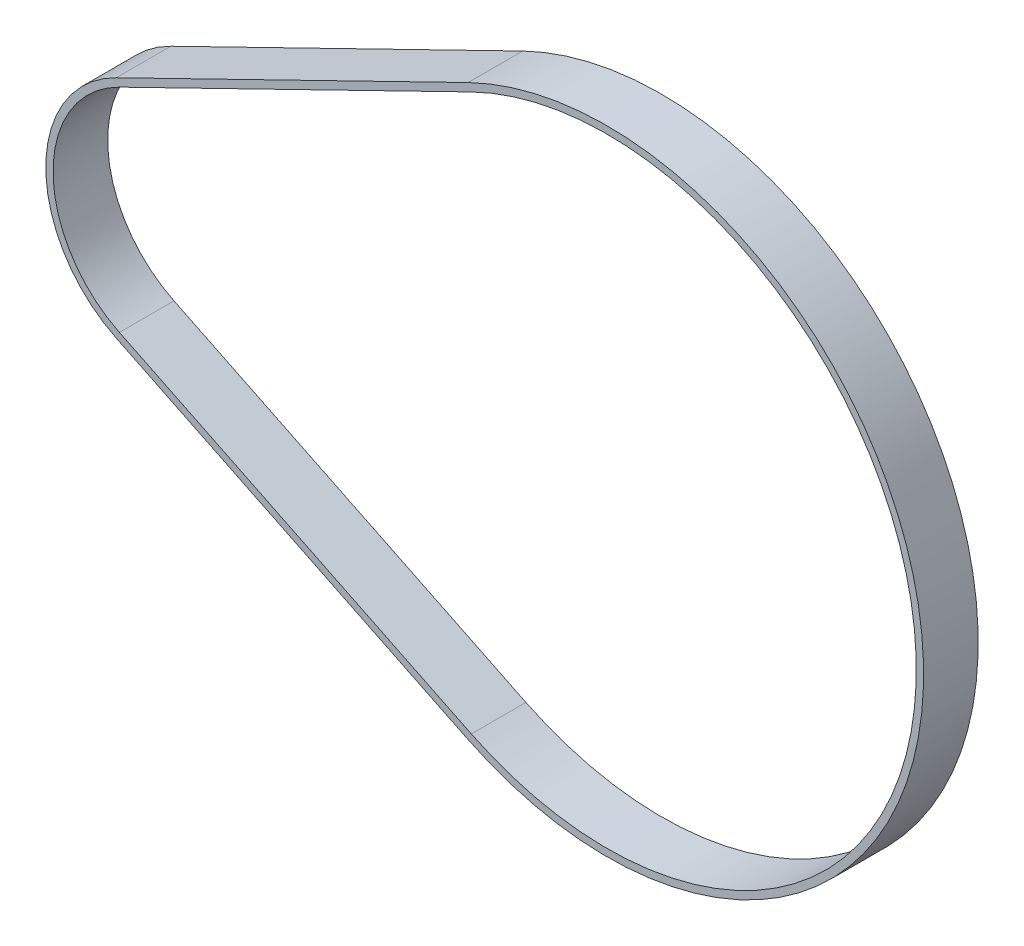
ISO-10303-21;
HEADER;
FILE_DESCRIPTION(('STEP AP214'),'2;1');
FILE_NAME('part.step','',(''),(''),'','','');
FILE_SCHEMA(('AUTOMOTIVE_DESIGN { 1 0 10303 214 1 1 1 1 }'));
ENDSEC;
DATA;
#1=APPLICATION_CONTEXT('core data for automotive mechanical design processes');
#2=APPLICATION_PROTOCOL_DEFINITION('international standard','automotive_design',2000,#1);
#3=PRODUCT_CONTEXT('',#1,'mechanical');
#4=PRODUCT('Part','Part','',(#3));
#5=PRODUCT_RELATED_PRODUCT_CATEGORY('part','',(#4));
#6=PRODUCT_DEFINITION_FORMATION('','',#4);
#7=PRODUCT_DEFINITION_CONTEXT('part definition',#1,'design');
#8=PRODUCT_DEFINITION('design','',#6,#7);
#9=PRODUCT_DEFINITION_SHAPE('','',#8);
#10=(LENGTH_UNIT() NAMED_UNIT(*) SI_UNIT(.MILLI.,.METRE.));
#11=(NAMED_UNIT(*) PLANE_ANGLE_UNIT() SI_UNIT($,.RADIAN.));
#12=(NAMED_UNIT(*) SI_UNIT($,.STERADIAN.) SOLID_ANGLE_UNIT());
#13=UNCERTAINTY_MEASURE_WITH_UNIT(LENGTH_MEASURE(1.E-05),#10,'distance_accuracy_value','');
#14=(GEOMETRIC_REPRESENTATION_CONTEXT(3) GLOBAL_UNCERTAINTY_ASSIGNED_CONTEXT((#13)) GLOBAL_UNIT_ASSIGNED_CONTEXT((#10,
#11,#12)) REPRESENTATION_CONTEXT('',''));
#15=CARTESIAN_POINT('',(0.,0.,0.));
#16=DIRECTION('',(0.,0.,1.));
#17=DIRECTION('',(1.,0.,0.));
#18=AXIS2_PLACEMENT_3D('',#15,#16,#17);
#19=CARTESIAN_POINT('',(-7.12971348626468E-13,0.,3.));
#20=DIRECTION('',(0.,0.,1.));
#21=DIRECTION('',(1.,0.,0.));
#22=AXIS2_PLACEMENT_3D('',#19,#20,#21);
#23=PLANE('',#22);
#24=CARTESIAN_POINT('',(-7.12971348626468E-13,0.,3.));
#25=DIRECTION('',(0.,0.,1.));
#26=DIRECTION('',(1.,0.,0.));
#27=AXIS2_PLACEMENT_3D('',#24,#25,#26);
#28=CIRCLE('',#27,13.7880149999993);
#29=CARTESIAN_POINT('',(-6.0485457965502,12.390498431752,3.));
#30=VERTEX_POINT('',#29);
#31=CARTESIAN_POINT('',(-6.0485457965502,-12.390498431752,3.));
#32=VERTEX_POINT('',#31);
#33=EDGE_CURVE('E115',#30,#32,#28,.T.);
#34=ORIENTED_EDGE('',*,*,#33,.T.);
#35=DIRECTION('',(0.89864265681118,-0.438681405303831,0.));
#36=VECTOR('',#35,1.);
#37=CARTESIAN_POINT('',(-6.0485457965502,-12.390498431752,3.));
#38=LINE('',#37,#36);
#39=CARTESIAN_POINT('',(32.625436737491,-31.269590001844,3.));
#40=VERTEX_POINT('',#39);
#41=EDGE_CURVE('E158',#32,#40,#38,.T.);
#42=ORIENTED_EDGE('',*,*,#41,.T.);
#43=CARTESIAN_POINT('',(47.8899999999999,0.,3.));
#44=DIRECTION('',(0.,0.,1.));
#45=DIRECTION('',(1.,0.,0.));
#46=AXIS2_PLACEMENT_3D('',#43,#44,#45);
#47=CIRCLE('',#46,34.7964675);
#48=CARTESIAN_POINT('',(32.625436737491,31.269590001844,3.));
#49=VERTEX_POINT('',#48);
#50=EDGE_CURVE('E160',#40,#49,#47,.T.);
#51=ORIENTED_EDGE('',*,*,#50,.T.);
#52=DIRECTION('',(-0.89864265681118,-0.438681405303831,0.));
#53=VECTOR('',#52,1.);
#54=CARTESIAN_POINT('',(32.625436737491,31.269590001844,3.));
#55=LINE('',#54,#53);
#56=EDGE_CURVE('E62',#49,#30,#55,.T.);
#57=ORIENTED_EDGE('',*,*,#56,.T.);
#58=EDGE_LOOP('',(#34,#42,#51,#57));
#59=FACE_BOUND('',#58,.T.);
#60=DIRECTION('',(0.898642656811188,-0.438681405303813,0.));
#61=VECTOR('',#60,1.);
#62=CARTESIAN_POINT('',(-5.6976006723071,-11.671584306304,3.));
#63=LINE('',#62,#61);
#64=CARTESIAN_POINT('',(-5.6976006723071,-11.671584306304,3.));
#65=VERTEX_POINT('',#64);
#66=CARTESIAN_POINT('',(32.976381861734,-30.550675876395,3.));
#67=VERTEX_POINT('',#66);
#68=EDGE_CURVE('E147',#65,#67,#63,.T.);
#69=ORIENTED_EDGE('',*,*,#68,.F.);
#70=CARTESIAN_POINT('',(-7.12971348626468E-13,0.,3.));
#71=DIRECTION('',(0.,0.,1.));
#72=DIRECTION('',(1.,0.,0.));
#73=AXIS2_PLACEMENT_3D('',#70,#71,#72);
#74=CIRCLE('',#73,12.9880150000001);
#75=CARTESIAN_POINT('',(-5.6976006723071,11.671584306304,3.));
#76=VERTEX_POINT('',#75);
#77=EDGE_CURVE('E112',#76,#65,#74,.T.);
#78=ORIENTED_EDGE('',*,*,#77,.F.);
#79=DIRECTION('',(-0.898642656811188,-0.438681405303813,0.));
#80=VECTOR('',#79,1.);
#81=CARTESIAN_POINT('',(32.976381861734,30.550675876395,3.));
#82=LINE('',#81,#80);
#83=CARTESIAN_POINT('',(32.976381861734,30.550675876395,3.));
#84=VERTEX_POINT('',#83);
#85=EDGE_CURVE('E151',#84,#76,#82,.T.);
#86=ORIENTED_EDGE('',*,*,#85,.F.);
#87=CARTESIAN_POINT('',(47.8899999999999,0.,3.));
#88=DIRECTION('',(0.,0.,1.));
#89=DIRECTION('',(1.,0.,0.));
#90=AXIS2_PLACEMENT_3D('',#87,#88,#89);
#91=CIRCLE('',#90,33.9964675);
#92=EDGE_CURVE('E149',#67,#84,#91,.T.);
#93=ORIENTED_EDGE('',*,*,#92,.F.);
#94=EDGE_LOOP('',(#69,#78,#86,#93));
#95=FACE_BOUND('',#94,.T.);
#96=ADVANCED_FACE('F39',(#59,#95),#23,.T.);
#97=CARTESIAN_POINT('',(-7.12971348626468E-13,0.,3.));
#98=DIRECTION('',(0.,0.,-1.));
#99=DIRECTION('',(-1.,0.,0.));
#100=AXIS2_PLACEMENT_3D('',#97,#98,#99);
#101=CYLINDRICAL_SURFACE('',#100,13.7880149999993);
#102=DIRECTION('',(0.,0.,-1.));
#103=VECTOR('',#102,1.);
#104=CARTESIAN_POINT('',(-6.0485457965502,12.390498431752,3.));
#105=LINE('',#104,#103);
#106=CARTESIAN_POINT('',(-6.0485457965502,12.390498431752,-3.));
#107=VERTEX_POINT('',#106);
#108=EDGE_CURVE('E163',#30,#107,#105,.T.);
#109=ORIENTED_EDGE('',*,*,#108,.T.);
#110=CARTESIAN_POINT('',(-7.12971348626468E-13,0.,-3.));
#111=DIRECTION('',(0.,0.,1.));
#112=DIRECTION('',(1.,0.,0.));
#113=AXIS2_PLACEMENT_3D('',#110,#111,#112);
#114=CIRCLE('',#113,13.7880149999993);
#115=CARTESIAN_POINT('',(-6.0485457965502,-12.390498431752,-3.));
#116=VERTEX_POINT('',#115);
#117=EDGE_CURVE('E134',#107,#116,#114,.T.);
#118=ORIENTED_EDGE('',*,*,#117,.T.);
#119=DIRECTION('',(0.,0.,-1.));
#120=VECTOR('',#119,1.);
#121=CARTESIAN_POINT('',(-6.0485457965502,-12.390498431752,3.));
#122=LINE('',#121,#120);
#123=EDGE_CURVE('E11',#32,#116,#122,.T.);
#124=ORIENTED_EDGE('',*,*,#123,.F.);
#125=ORIENTED_EDGE('',*,*,#33,.F.);
#126=EDGE_LOOP('',(#109,#118,#124,#125));
#127=FACE_BOUND('',#126,.T.);
#128=ADVANCED_FACE('F41',(#127),#101,.T.);
#129=CARTESIAN_POINT('',(-6.0485457965502,-12.390498431752,3.));
#130=DIRECTION('',(0.438681405303831,0.89864265681118,0.));
#131=DIRECTION('',(-0.89864265681118,0.438681405303831,0.));
#132=AXIS2_PLACEMENT_3D('',#129,#130,#131);
#133=PLANE('',#132);
#134=ORIENTED_EDGE('',*,*,#123,.T.);
#135=DIRECTION('',(0.89864265681118,-0.438681405303831,0.));
#136=VECTOR('',#135,1.);
#137=CARTESIAN_POINT('',(-6.0485457965502,-12.390498431752,-3.));
#138=LINE('',#137,#136);
#139=CARTESIAN_POINT('',(32.625436737491,-31.269590001844,-3.));
#140=VERTEX_POINT('',#139);
#141=EDGE_CURVE('E137',#116,#140,#138,.T.);
#142=ORIENTED_EDGE('',*,*,#141,.T.);
#143=DIRECTION('',(0.,0.,-1.));
#144=VECTOR('',#143,1.);
#145=CARTESIAN_POINT('',(32.625436737491,-31.269590001844,3.));
#146=LINE('',#145,#144);
#147=EDGE_CURVE('E47',#40,#140,#146,.T.);
#148=ORIENTED_EDGE('',*,*,#147,.F.);
#149=ORIENTED_EDGE('',*,*,#41,.F.);
#150=EDGE_LOOP('',(#134,#142,#148,#149));
#151=FACE_BOUND('',#150,.T.);
#152=ADVANCED_FACE('F176',(#151),#133,.F.);
#153=CARTESIAN_POINT('',(47.8899999999999,0.,3.));
#154=DIRECTION('',(0.,0.,-1.));
#155=DIRECTION('',(-1.,0.,0.));
#156=AXIS2_PLACEMENT_3D('',#153,#154,#155);
#157=CYLINDRICAL_SURFACE('',#156,34.7964675);
#158=ORIENTED_EDGE('',*,*,#147,.T.);
#159=CARTESIAN_POINT('',(47.8899999999999,0.,-3.));
#160=DIRECTION('',(0.,0.,1.));
#161=DIRECTION('',(1.,0.,0.));
#162=AXIS2_PLACEMENT_3D('',#159,#160,#161);
#163=CIRCLE('',#162,34.7964675);
#164=CARTESIAN_POINT('',(32.625436737491,31.269590001844,-3.));
#165=VERTEX_POINT('',#164);
#166=EDGE_CURVE('E140',#140,#165,#163,.T.);
#167=ORIENTED_EDGE('',*,*,#166,.T.);
#168=DIRECTION('',(0.,0.,-1.));
#169=VECTOR('',#168,1.);
#170=CARTESIAN_POINT('',(32.625436737491,31.269590001844,3.));
#171=LINE('',#170,#169);
#172=EDGE_CURVE('E165',#49,#165,#171,.T.);
#173=ORIENTED_EDGE('',*,*,#172,.F.);
#174=ORIENTED_EDGE('',*,*,#50,.F.);
#175=EDGE_LOOP('',(#158,#167,#173,#174));
#176=FACE_BOUND('',#175,.T.);
#177=ADVANCED_FACE('F170',(#176),#157,.T.);
#178=CARTESIAN_POINT('',(32.625436737491,31.269590001844,3.));
#179=DIRECTION('',(0.438681405303831,-0.89864265681118,0.));
#180=DIRECTION('',(0.89864265681118,0.438681405303831,0.));
#181=AXIS2_PLACEMENT_3D('',#178,#179,#180);
#182=PLANE('',#181);
#183=ORIENTED_EDGE('',*,*,#172,.T.);
#184=DIRECTION('',(-0.89864265681118,-0.438681405303831,0.));
#185=VECTOR('',#184,1.);
#186=CARTESIAN_POINT('',(32.625436737491,31.269590001844,-3.));
#187=LINE('',#186,#185);
#188=EDGE_CURVE('E143',#165,#107,#187,.T.);
#189=ORIENTED_EDGE('',*,*,#188,.T.);
#190=ORIENTED_EDGE('',*,*,#108,.F.);
#191=ORIENTED_EDGE('',*,*,#56,.F.);
#192=EDGE_LOOP('',(#183,#189,#190,#191));
#193=FACE_BOUND('',#192,.T.);
#194=ADVANCED_FACE('F181',(#193),#182,.F.);
#195=CARTESIAN_POINT('',(-7.12971348626468E-13,0.,3.));
#196=DIRECTION('',(0.,0.,-1.));
#197=DIRECTION('',(-1.,0.,0.));
#198=AXIS2_PLACEMENT_3D('',#195,#196,#197);
#199=CYLINDRICAL_SURFACE('',#198,12.9880150000001);
#200=DIRECTION('',(0.,0.,-1.));
#201=VECTOR('',#200,1.);
#202=CARTESIAN_POINT('',(-5.6976006723071,-11.671584306304,3.));
#203=LINE('',#202,#201);
#204=CARTESIAN_POINT('',(-5.6976006723071,-11.671584306304,-3.));
#205=VERTEX_POINT('',#204);
#206=EDGE_CURVE('E104',#65,#205,#203,.T.);
#207=ORIENTED_EDGE('',*,*,#206,.T.);
#208=CARTESIAN_POINT('',(-7.12971348626468E-13,0.,-3.));
#209=DIRECTION('',(0.,0.,1.));
#210=DIRECTION('',(1.,0.,0.));
#211=AXIS2_PLACEMENT_3D('',#208,#209,#210);
#212=CIRCLE('',#211,12.9880150000001);
#213=CARTESIAN_POINT('',(-5.6976006723071,11.671584306304,-3.));
#214=VERTEX_POINT('',#213);
#215=EDGE_CURVE('E109',#214,#205,#212,.T.);
#216=ORIENTED_EDGE('',*,*,#215,.F.);
#217=DIRECTION('',(0.,0.,-1.));
#218=VECTOR('',#217,1.);
#219=CARTESIAN_POINT('',(-5.6976006723071,11.671584306304,3.));
#220=LINE('',#219,#218);
#221=EDGE_CURVE('E153',#76,#214,#220,.T.);
#222=ORIENTED_EDGE('',*,*,#221,.F.);
#223=ORIENTED_EDGE('',*,*,#77,.T.);
#224=EDGE_LOOP('',(#207,#216,#222,#223));
#225=FACE_BOUND('',#224,.T.);
#226=ADVANCED_FACE('F106',(#225),#199,.F.);
#227=CARTESIAN_POINT('',(-5.6976006723071,-11.671584306304,3.));
#228=DIRECTION('',(0.438681405303813,0.898642656811188,0.));
#229=DIRECTION('',(-0.898642656811188,0.438681405303813,0.));
#230=AXIS2_PLACEMENT_3D('',#227,#228,#229);
#231=PLANE('',#230);
#232=DIRECTION('',(0.,0.,-1.));
#233=VECTOR('',#232,1.);
#234=CARTESIAN_POINT('',(32.976381861734,-30.550675876395,3.));
#235=LINE('',#234,#233);
#236=CARTESIAN_POINT('',(32.976381861734,-30.550675876395,-3.));
#237=VERTEX_POINT('',#236);
#238=EDGE_CURVE('E116',#67,#237,#235,.T.);
#239=ORIENTED_EDGE('',*,*,#238,.T.);
#240=DIRECTION('',(0.898642656811188,-0.438681405303813,0.));
#241=VECTOR('',#240,1.);
#242=CARTESIAN_POINT('',(-5.6976006723071,-11.671584306304,-3.));
#243=LINE('',#242,#241);
#244=EDGE_CURVE('E119',#205,#237,#243,.T.);
#245=ORIENTED_EDGE('',*,*,#244,.F.);
#246=ORIENTED_EDGE('',*,*,#206,.F.);
#247=ORIENTED_EDGE('',*,*,#68,.T.);
#248=EDGE_LOOP('',(#239,#245,#246,#247));
#249=FACE_BOUND('',#248,.T.);
#250=ADVANCED_FACE('F120',(#249),#231,.T.);
#251=CARTESIAN_POINT('',(47.8899999999999,0.,3.));
#252=DIRECTION('',(0.,0.,-1.));
#253=DIRECTION('',(-1.,0.,0.));
#254=AXIS2_PLACEMENT_3D('',#251,#252,#253);
#255=CYLINDRICAL_SURFACE('',#254,33.9964675);
#256=DIRECTION('',(0.,0.,-1.));
#257=VECTOR('',#256,1.);
#258=CARTESIAN_POINT('',(32.976381861734,30.550675876395,3.));
#259=LINE('',#258,#257);
#260=CARTESIAN_POINT('',(32.976381861734,30.550675876395,-3.));
#261=VERTEX_POINT('',#260);
#262=EDGE_CURVE('E54',#84,#261,#259,.T.);
#263=ORIENTED_EDGE('',*,*,#262,.T.);
#264=CARTESIAN_POINT('',(47.8899999999999,0.,-3.));
#265=DIRECTION('',(0.,0.,1.));
#266=DIRECTION('',(1.,0.,0.));
#267=AXIS2_PLACEMENT_3D('',#264,#265,#266);
#268=CIRCLE('',#267,33.9964675);
#269=EDGE_CURVE('E125',#237,#261,#268,.T.);
#270=ORIENTED_EDGE('',*,*,#269,.F.);
#271=ORIENTED_EDGE('',*,*,#238,.F.);
#272=ORIENTED_EDGE('',*,*,#92,.T.);
#273=EDGE_LOOP('',(#263,#270,#271,#272));
#274=FACE_BOUND('',#273,.T.);
#275=ADVANCED_FACE('F199',(#274),#255,.F.);
#276=CARTESIAN_POINT('',(32.976381861734,30.550675876395,3.));
#277=DIRECTION('',(0.438681405303813,-0.898642656811188,0.));
#278=DIRECTION('',(0.898642656811188,0.438681405303813,0.));
#279=AXIS2_PLACEMENT_3D('',#276,#277,#278);
#280=PLANE('',#279);
#281=ORIENTED_EDGE('',*,*,#221,.T.);
#282=DIRECTION('',(-0.898642656811188,-0.438681405303813,0.));
#283=VECTOR('',#282,1.);
#284=CARTESIAN_POINT('',(32.976381861734,30.550675876395,-3.));
#285=LINE('',#284,#283);
#286=EDGE_CURVE('E129',#261,#214,#285,.T.);
#287=ORIENTED_EDGE('',*,*,#286,.F.);
#288=ORIENTED_EDGE('',*,*,#262,.F.);
#289=ORIENTED_EDGE('',*,*,#85,.T.);
#290=EDGE_LOOP('',(#281,#287,#288,#289));
#291=FACE_BOUND('',#290,.T.);
#292=ADVANCED_FACE('F202',(#291),#280,.T.);
#293=CARTESIAN_POINT('',(-7.12971348626468E-13,0.,-3.));
#294=DIRECTION('',(0.,0.,1.));
#295=DIRECTION('',(1.,0.,0.));
#296=AXIS2_PLACEMENT_3D('',#293,#294,#295);
#297=PLANE('',#296);
#298=ORIENTED_EDGE('',*,*,#286,.T.);
#299=ORIENTED_EDGE('',*,*,#215,.T.);
#300=ORIENTED_EDGE('',*,*,#244,.T.);
#301=ORIENTED_EDGE('',*,*,#269,.T.);
#302=EDGE_LOOP('',(#298,#299,#300,#301));
#303=FACE_BOUND('',#302,.T.);
#304=ORIENTED_EDGE('',*,*,#117,.F.);
#305=ORIENTED_EDGE('',*,*,#188,.F.);
#306=ORIENTED_EDGE('',*,*,#166,.F.);
#307=ORIENTED_EDGE('',*,*,#141,.F.);
#308=EDGE_LOOP('',(#304,#305,#306,#307));
#309=FACE_BOUND('',#308,.T.);
#310=ADVANCED_FACE('F127',(#303,#309),#297,.F.);
#311=CLOSED_SHELL('',(#96,#128,#152,#177,#194,#226,#250,#275,#292,#310));
#312=MANIFOLD_SOLID_BREP('B2',#311);
#313=ADVANCED_BREP_SHAPE_REPRESENTATION('',(#18,#312),#14);
#314=SHAPE_DEFINITION_REPRESENTATION(#9,#313);
ENDSEC;
END-ISO-10303-21;
